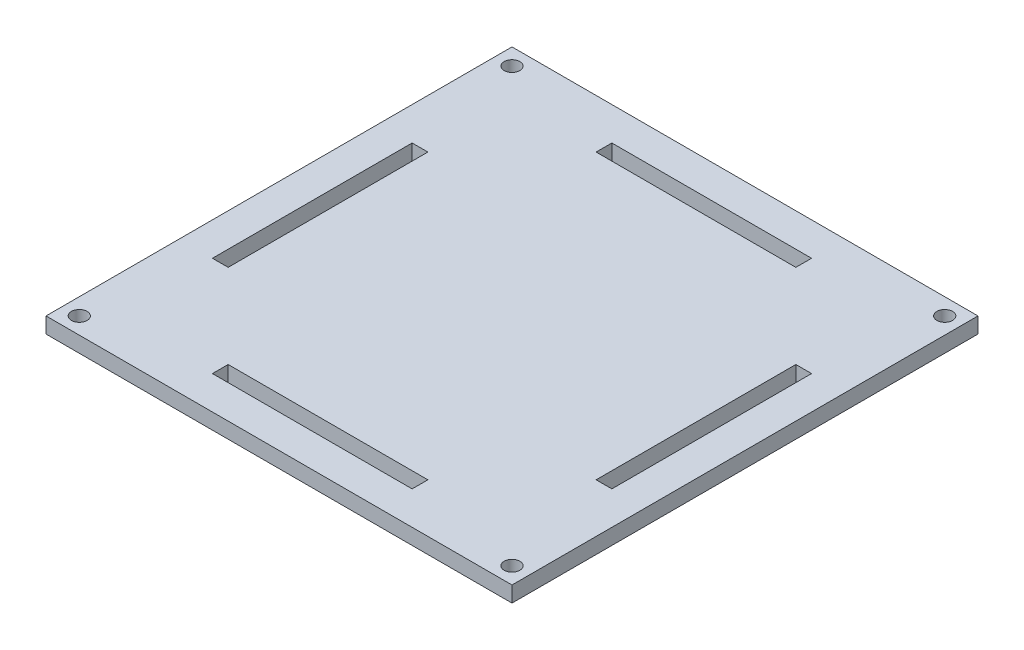
ISO-10303-21;
HEADER;
FILE_DESCRIPTION(('STEP AP214'),'2;1');
FILE_NAME('part.step','',(''),(''),'','','');
FILE_SCHEMA(('AUTOMOTIVE_DESIGN { 1 0 10303 214 1 1 1 1 }'));
ENDSEC;
DATA;
#1=APPLICATION_CONTEXT('core data for automotive mechanical design processes');
#2=APPLICATION_PROTOCOL_DEFINITION('international standard','automotive_design',2000,#1);
#3=PRODUCT_CONTEXT('',#1,'mechanical');
#4=PRODUCT('Part','Part','',(#3));
#5=PRODUCT_RELATED_PRODUCT_CATEGORY('part','',(#4));
#6=PRODUCT_DEFINITION_FORMATION('','',#4);
#7=PRODUCT_DEFINITION_CONTEXT('part definition',#1,'design');
#8=PRODUCT_DEFINITION('design','',#6,#7);
#9=PRODUCT_DEFINITION_SHAPE('','',#8);
#10=(LENGTH_UNIT() NAMED_UNIT(*) SI_UNIT(.MILLI.,.METRE.));
#11=(NAMED_UNIT(*) PLANE_ANGLE_UNIT() SI_UNIT($,.RADIAN.));
#12=(NAMED_UNIT(*) SI_UNIT($,.STERADIAN.) SOLID_ANGLE_UNIT());
#13=UNCERTAINTY_MEASURE_WITH_UNIT(LENGTH_MEASURE(1.E-05),#10,'distance_accuracy_value','');
#14=(GEOMETRIC_REPRESENTATION_CONTEXT(3) GLOBAL_UNCERTAINTY_ASSIGNED_CONTEXT((#13)) GLOBAL_UNIT_ASSIGNED_CONTEXT((#10,
#11,#12)) REPRESENTATION_CONTEXT('',''));
#15=CARTESIAN_POINT('',(0.,0.,0.));
#16=DIRECTION('',(0.,0.,1.));
#17=DIRECTION('',(1.,0.,0.));
#18=AXIS2_PLACEMENT_3D('',#15,#16,#17);
#19=CARTESIAN_POINT('',(44.45,0.,88.9));
#20=DIRECTION('',(1.,0.,0.));
#21=DIRECTION('',(0.,0.,-1.));
#22=AXIS2_PLACEMENT_3D('',#19,#20,#21);
#23=PLANE('',#22);
#24=DIRECTION('',(0.,-1.,0.));
#25=VECTOR('',#24,1.);
#26=CARTESIAN_POINT('',(44.45,0.,0.));
#27=LINE('',#26,#25);
#28=CARTESIAN_POINT('',(44.45,1.5,0.));
#29=VERTEX_POINT('',#28);
#30=CARTESIAN_POINT('',(44.45,-1.5,0.));
#31=VERTEX_POINT('',#30);
#32=EDGE_CURVE('E378',#29,#31,#27,.T.);
#33=ORIENTED_EDGE('',*,*,#32,.F.);
#34=DIRECTION('',(0.,0.,-1.));
#35=VECTOR('',#34,1.);
#36=CARTESIAN_POINT('',(44.45,1.5,88.9));
#37=LINE('',#36,#35);
#38=CARTESIAN_POINT('',(44.45,1.5,88.9));
#39=VERTEX_POINT('',#38);
#40=EDGE_CURVE('E12',#39,#29,#37,.T.);
#41=ORIENTED_EDGE('',*,*,#40,.F.);
#42=DIRECTION('',(0.,-1.,0.));
#43=VECTOR('',#42,1.);
#44=CARTESIAN_POINT('',(44.45,0.,88.9));
#45=LINE('',#44,#43);
#46=CARTESIAN_POINT('',(44.45,-1.5,88.9));
#47=VERTEX_POINT('',#46);
#48=EDGE_CURVE('E379',#39,#47,#45,.T.);
#49=ORIENTED_EDGE('',*,*,#48,.T.);
#50=DIRECTION('',(0.,0.,-1.));
#51=VECTOR('',#50,1.);
#52=CARTESIAN_POINT('',(44.45,-1.5,88.9));
#53=LINE('',#52,#51);
#54=EDGE_CURVE('E398',#47,#31,#53,.T.);
#55=ORIENTED_EDGE('',*,*,#54,.T.);
#56=EDGE_LOOP('',(#33,#41,#49,#55));
#57=FACE_BOUND('',#56,.T.);
#58=ADVANCED_FACE('F49',(#57),#23,.T.);
#59=CARTESIAN_POINT('',(0.,1.5,88.9));
#60=DIRECTION('',(0.,1.,0.));
#61=DIRECTION('',(0.,0.,1.));
#62=AXIS2_PLACEMENT_3D('',#59,#60,#61);
#63=PLANE('',#62);
#64=DIRECTION('',(0.,0.,-1.));
#65=VECTOR('',#64,1.);
#66=CARTESIAN_POINT('',(-35.1,1.5,63.5));
#67=LINE('',#66,#65);
#68=CARTESIAN_POINT('',(-35.1,1.5,63.5));
#69=VERTEX_POINT('',#68);
#70=CARTESIAN_POINT('',(-35.1,1.5,25.4));
#71=VERTEX_POINT('',#70);
#72=EDGE_CURVE('E65',#69,#71,#67,.T.);
#73=ORIENTED_EDGE('',*,*,#72,.F.);
#74=DIRECTION('',(1.,0.,0.));
#75=VECTOR('',#74,1.);
#76=CARTESIAN_POINT('',(-38.1,1.5,63.5));
#77=LINE('',#76,#75);
#78=CARTESIAN_POINT('',(-38.1,1.5,63.5));
#79=VERTEX_POINT('',#78);
#80=EDGE_CURVE('E212',#79,#69,#77,.T.);
#81=ORIENTED_EDGE('',*,*,#80,.F.);
#82=DIRECTION('',(0.,0.,1.));
#83=VECTOR('',#82,1.);
#84=CARTESIAN_POINT('',(-38.1,1.5,63.5));
#85=LINE('',#84,#83);
#86=CARTESIAN_POINT('',(-38.1,1.5,25.4));
#87=VERTEX_POINT('',#86);
#88=EDGE_CURVE('E193',#87,#79,#85,.T.);
#89=ORIENTED_EDGE('',*,*,#88,.F.);
#90=DIRECTION('',(-1.,0.,0.));
#91=VECTOR('',#90,1.);
#92=CARTESIAN_POINT('',(-38.1,1.5,25.4));
#93=LINE('',#92,#91);
#94=EDGE_CURVE('E204',#71,#87,#93,.T.);
#95=ORIENTED_EDGE('',*,*,#94,.F.);
#96=EDGE_LOOP('',(#73,#81,#89,#95));
#97=FACE_BOUND('',#96,.T.);
#98=DIRECTION('',(0.,0.,-1.));
#99=VECTOR('',#98,1.);
#100=CARTESIAN_POINT('',(19.0500000000001,1.5,6.35000000000006));
#101=LINE('',#100,#99);
#102=CARTESIAN_POINT('',(19.0500000000001,1.5,9.35000000000006));
#103=VERTEX_POINT('',#102);
#104=CARTESIAN_POINT('',(19.0500000000001,1.5,6.35000000000006));
#105=VERTEX_POINT('',#104);
#106=EDGE_CURVE('E73',#103,#105,#101,.T.);
#107=ORIENTED_EDGE('',*,*,#106,.F.);
#108=DIRECTION('',(1.,0.,0.));
#109=VECTOR('',#108,1.);
#110=CARTESIAN_POINT('',(-19.0499999999999,1.5,9.34999999999993));
#111=LINE('',#110,#109);
#112=CARTESIAN_POINT('',(-19.0499999999999,1.5,9.34999999999993));
#113=VERTEX_POINT('',#112);
#114=EDGE_CURVE('E540',#113,#103,#111,.T.);
#115=ORIENTED_EDGE('',*,*,#114,.F.);
#116=DIRECTION('',(0.,0.,1.));
#117=VECTOR('',#116,1.);
#118=CARTESIAN_POINT('',(-19.0499999999999,1.5,6.34999999999993));
#119=LINE('',#118,#117);
#120=CARTESIAN_POINT('',(-19.0499999999999,1.5,6.34999999999993));
#121=VERTEX_POINT('',#120);
#122=EDGE_CURVE('E551',#121,#113,#119,.T.);
#123=ORIENTED_EDGE('',*,*,#122,.F.);
#124=DIRECTION('',(-1.,0.,0.));
#125=VECTOR('',#124,1.);
#126=CARTESIAN_POINT('',(-19.0499999999999,1.5,6.34999999999993));
#127=LINE('',#126,#125);
#128=EDGE_CURVE('E235',#105,#121,#127,.T.);
#129=ORIENTED_EDGE('',*,*,#128,.F.);
#130=EDGE_LOOP('',(#107,#115,#123,#129));
#131=FACE_BOUND('',#130,.T.);
#132=DIRECTION('',(1.,0.,0.));
#133=VECTOR('',#132,1.);
#134=CARTESIAN_POINT('',(38.0999999999999,1.5,63.5000000000003));
#135=LINE('',#134,#133);
#136=CARTESIAN_POINT('',(35.0999999999999,1.5,63.5000000000002));
#137=VERTEX_POINT('',#136);
#138=CARTESIAN_POINT('',(38.0999999999999,1.5,63.5000000000003));
#139=VERTEX_POINT('',#138);
#140=EDGE_CURVE('E290',#137,#139,#135,.T.);
#141=ORIENTED_EDGE('',*,*,#140,.F.);
#142=DIRECTION('',(0.,0.,1.));
#143=VECTOR('',#142,1.);
#144=CARTESIAN_POINT('',(35.1000000000001,1.5,25.4000000000003));
#145=LINE('',#144,#143);
#146=CARTESIAN_POINT('',(35.1000000000001,1.5,25.4000000000003));
#147=VERTEX_POINT('',#146);
#148=EDGE_CURVE('E259',#147,#137,#145,.T.);
#149=ORIENTED_EDGE('',*,*,#148,.F.);
#150=DIRECTION('',(-1.,0.,0.));
#151=VECTOR('',#150,1.);
#152=CARTESIAN_POINT('',(38.1000000000001,1.5,25.4000000000003));
#153=LINE('',#152,#151);
#154=CARTESIAN_POINT('',(38.1000000000001,1.5,25.4000000000003));
#155=VERTEX_POINT('',#154);
#156=EDGE_CURVE('E274',#155,#147,#153,.T.);
#157=ORIENTED_EDGE('',*,*,#156,.F.);
#158=DIRECTION('',(0.,0.,-1.));
#159=VECTOR('',#158,1.);
#160=CARTESIAN_POINT('',(38.1000000000001,1.5,25.4000000000003));
#161=LINE('',#160,#159);
#162=EDGE_CURVE('E286',#139,#155,#161,.T.);
#163=ORIENTED_EDGE('',*,*,#162,.F.);
#164=EDGE_LOOP('',(#141,#149,#157,#163));
#165=FACE_BOUND('',#164,.T.);
#166=DIRECTION('',(0.,0.,1.));
#167=VECTOR('',#166,1.);
#168=CARTESIAN_POINT('',(-19.0500000000004,1.5,82.5499999999998));
#169=LINE('',#168,#167);
#170=CARTESIAN_POINT('',(-19.0500000000004,1.5,79.5499999999998));
#171=VERTEX_POINT('',#170);
#172=CARTESIAN_POINT('',(-19.0500000000004,1.5,82.5499999999998));
#173=VERTEX_POINT('',#172);
#174=EDGE_CURVE('E254',#171,#173,#169,.T.);
#175=ORIENTED_EDGE('',*,*,#174,.F.);
#176=DIRECTION('',(-1.,0.,0.));
#177=VECTOR('',#176,1.);
#178=CARTESIAN_POINT('',(19.0499999999996,1.5,79.5500000000002));
#179=LINE('',#178,#177);
#180=CARTESIAN_POINT('',(19.0499999999996,1.5,79.5500000000002));
#181=VERTEX_POINT('',#180);
#182=EDGE_CURVE('E310',#181,#171,#179,.T.);
#183=ORIENTED_EDGE('',*,*,#182,.F.);
#184=DIRECTION('',(0.,0.,-1.));
#185=VECTOR('',#184,1.);
#186=CARTESIAN_POINT('',(19.0499999999996,1.5,82.5500000000002));
#187=LINE('',#186,#185);
#188=CARTESIAN_POINT('',(19.0499999999996,1.5,82.5500000000002));
#189=VERTEX_POINT('',#188);
#190=EDGE_CURVE('E325',#189,#181,#187,.T.);
#191=ORIENTED_EDGE('',*,*,#190,.F.);
#192=DIRECTION('',(1.,0.,0.));
#193=VECTOR('',#192,1.);
#194=CARTESIAN_POINT('',(19.0499999999996,1.5,82.5500000000002));
#195=LINE('',#194,#193);
#196=EDGE_CURVE('E333',#173,#189,#195,.T.);
#197=ORIENTED_EDGE('',*,*,#196,.F.);
#198=EDGE_LOOP('',(#175,#183,#191,#197));
#199=FACE_BOUND('',#198,.T.);
#200=CARTESIAN_POINT('',(41.275,1.5,85.725));
#201=DIRECTION('',(0.,1.,0.));
#202=DIRECTION('',(0.,0.,1.));
#203=AXIS2_PLACEMENT_3D('',#200,#201,#202);
#204=CIRCLE('',#203,1.5);
#205=CARTESIAN_POINT('',(41.275,1.5,87.225));
#206=VERTEX_POINT('',#205);
#207=EDGE_CURVE('E372',#206,#206,#204,.T.);
#208=ORIENTED_EDGE('',*,*,#207,.F.);
#209=EDGE_LOOP('',(#208));
#210=FACE_BOUND('',#209,.T.);
#211=CARTESIAN_POINT('',(41.275,1.5,3.17500000000001));
#212=DIRECTION('',(0.,1.,0.));
#213=DIRECTION('',(0.,0.,1.));
#214=AXIS2_PLACEMENT_3D('',#211,#212,#213);
#215=CIRCLE('',#214,1.50000000000001);
#216=CARTESIAN_POINT('',(41.275,1.5,4.67500000000002));
#217=VERTEX_POINT('',#216);
#218=EDGE_CURVE('E353',#217,#217,#215,.T.);
#219=ORIENTED_EDGE('',*,*,#218,.F.);
#220=EDGE_LOOP('',(#219));
#221=FACE_BOUND('',#220,.T.);
#222=CARTESIAN_POINT('',(-41.275,1.5,3.17500000000001));
#223=DIRECTION('',(0.,1.,0.));
#224=DIRECTION('',(0.,0.,1.));
#225=AXIS2_PLACEMENT_3D('',#222,#223,#224);
#226=CIRCLE('',#225,1.50000000000001);
#227=CARTESIAN_POINT('',(-41.275,1.5,4.67500000000002));
#228=VERTEX_POINT('',#227);
#229=EDGE_CURVE('E352',#228,#228,#226,.T.);
#230=ORIENTED_EDGE('',*,*,#229,.F.);
#231=EDGE_LOOP('',(#230));
#232=FACE_BOUND('',#231,.T.);
#233=CARTESIAN_POINT('',(-41.275,1.5,85.725));
#234=DIRECTION('',(0.,1.,0.));
#235=DIRECTION('',(0.,0.,1.));
#236=AXIS2_PLACEMENT_3D('',#233,#234,#235);
#237=CIRCLE('',#236,1.50000000000001);
#238=CARTESIAN_POINT('',(-41.275,1.5,87.225));
#239=VERTEX_POINT('',#238);
#240=EDGE_CURVE('E358',#239,#239,#237,.T.);
#241=ORIENTED_EDGE('',*,*,#240,.F.);
#242=EDGE_LOOP('',(#241));
#243=FACE_BOUND('',#242,.T.);
#244=DIRECTION('',(1.,0.,0.));
#245=VECTOR('',#244,1.);
#246=CARTESIAN_POINT('',(0.,1.5,0.));
#247=LINE('',#246,#245);
#248=CARTESIAN_POINT('',(-44.45,1.5,0.));
#249=VERTEX_POINT('',#248);
#250=EDGE_CURVE('E407',#249,#29,#247,.T.);
#251=ORIENTED_EDGE('',*,*,#250,.F.);
#252=DIRECTION('',(0.,0.,-1.));
#253=VECTOR('',#252,1.);
#254=CARTESIAN_POINT('',(-44.45,1.5,88.9));
#255=LINE('',#254,#253);
#256=CARTESIAN_POINT('',(-44.45,1.5,88.9));
#257=VERTEX_POINT('',#256);
#258=EDGE_CURVE('E58',#257,#249,#255,.T.);
#259=ORIENTED_EDGE('',*,*,#258,.F.);
#260=DIRECTION('',(1.,0.,0.));
#261=VECTOR('',#260,1.);
#262=CARTESIAN_POINT('',(0.,1.5,88.9));
#263=LINE('',#262,#261);
#264=EDGE_CURVE('E383',#257,#39,#263,.T.);
#265=ORIENTED_EDGE('',*,*,#264,.T.);
#266=ORIENTED_EDGE('',*,*,#40,.T.);
#267=EDGE_LOOP('',(#251,#259,#265,#266));
#268=FACE_BOUND('',#267,.T.);
#269=ADVANCED_FACE('F209',(#97,#131,#165,#199,#210,#221,#232,#243,#268),#63,.T.);
#270=CARTESIAN_POINT('',(-44.45,0.,88.9));
#271=DIRECTION('',(1.,0.,0.));
#272=DIRECTION('',(0.,0.,-1.));
#273=AXIS2_PLACEMENT_3D('',#270,#271,#272);
#274=PLANE('',#273);
#275=DIRECTION('',(0.,-1.,0.));
#276=VECTOR('',#275,1.);
#277=CARTESIAN_POINT('',(-44.45,0.,0.));
#278=LINE('',#277,#276);
#279=CARTESIAN_POINT('',(-44.45,-1.5,0.));
#280=VERTEX_POINT('',#279);
#281=EDGE_CURVE('E405',#249,#280,#278,.T.);
#282=ORIENTED_EDGE('',*,*,#281,.T.);
#283=DIRECTION('',(0.,0.,-1.));
#284=VECTOR('',#283,1.);
#285=CARTESIAN_POINT('',(-44.45,-1.5,88.9));
#286=LINE('',#285,#284);
#287=CARTESIAN_POINT('',(-44.45,-1.5,88.9));
#288=VERTEX_POINT('',#287);
#289=EDGE_CURVE('E394',#288,#280,#286,.T.);
#290=ORIENTED_EDGE('',*,*,#289,.F.);
#291=DIRECTION('',(0.,-1.,0.));
#292=VECTOR('',#291,1.);
#293=CARTESIAN_POINT('',(-44.45,0.,88.9));
#294=LINE('',#293,#292);
#295=EDGE_CURVE('E389',#257,#288,#294,.T.);
#296=ORIENTED_EDGE('',*,*,#295,.F.);
#297=ORIENTED_EDGE('',*,*,#258,.T.);
#298=EDGE_LOOP('',(#282,#290,#296,#297));
#299=FACE_BOUND('',#298,.T.);
#300=ADVANCED_FACE('F425',(#299),#274,.F.);
#301=CARTESIAN_POINT('',(0.,-1.5,88.9));
#302=DIRECTION('',(0.,1.,0.));
#303=DIRECTION('',(0.,0.,1.));
#304=AXIS2_PLACEMENT_3D('',#301,#302,#303);
#305=PLANE('',#304);
#306=DIRECTION('',(-1.,0.,0.));
#307=VECTOR('',#306,1.);
#308=CARTESIAN_POINT('',(-38.1,-1.5,63.5));
#309=LINE('',#308,#307);
#310=CARTESIAN_POINT('',(-35.1,-1.5,63.5));
#311=VERTEX_POINT('',#310);
#312=CARTESIAN_POINT('',(-38.1,-1.5,63.5));
#313=VERTEX_POINT('',#312);
#314=EDGE_CURVE('E463',#311,#313,#309,.T.);
#315=ORIENTED_EDGE('',*,*,#314,.F.);
#316=DIRECTION('',(0.,0.,1.));
#317=VECTOR('',#316,1.);
#318=CARTESIAN_POINT('',(-35.1,-1.5,63.5));
#319=LINE('',#318,#317);
#320=CARTESIAN_POINT('',(-35.1,-1.5,25.4));
#321=VERTEX_POINT('',#320);
#322=EDGE_CURVE('E523',#321,#311,#319,.T.);
#323=ORIENTED_EDGE('',*,*,#322,.F.);
#324=DIRECTION('',(1.,0.,0.));
#325=VECTOR('',#324,1.);
#326=CARTESIAN_POINT('',(-38.1,-1.5,25.4));
#327=LINE('',#326,#325);
#328=CARTESIAN_POINT('',(-38.1,-1.5,25.4));
#329=VERTEX_POINT('',#328);
#330=EDGE_CURVE('E521',#329,#321,#327,.T.);
#331=ORIENTED_EDGE('',*,*,#330,.F.);
#332=DIRECTION('',(0.,0.,-1.));
#333=VECTOR('',#332,1.);
#334=CARTESIAN_POINT('',(-38.1,-1.5,63.5));
#335=LINE('',#334,#333);
#336=EDGE_CURVE('E196',#313,#329,#335,.T.);
#337=ORIENTED_EDGE('',*,*,#336,.F.);
#338=EDGE_LOOP('',(#315,#323,#331,#337));
#339=FACE_BOUND('',#338,.T.);
#340=DIRECTION('',(-1.,0.,0.));
#341=VECTOR('',#340,1.);
#342=CARTESIAN_POINT('',(-19.0499999999999,-1.5,9.34999999999993));
#343=LINE('',#342,#341);
#344=CARTESIAN_POINT('',(19.0500000000001,-1.5,9.35000000000006));
#345=VERTEX_POINT('',#344);
#346=CARTESIAN_POINT('',(-19.0499999999999,-1.5,9.34999999999993));
#347=VERTEX_POINT('',#346);
#348=EDGE_CURVE('E241',#345,#347,#343,.T.);
#349=ORIENTED_EDGE('',*,*,#348,.F.);
#350=DIRECTION('',(0.,0.,1.));
#351=VECTOR('',#350,1.);
#352=CARTESIAN_POINT('',(19.0500000000001,-1.5,6.35000000000006));
#353=LINE('',#352,#351);
#354=CARTESIAN_POINT('',(19.0500000000001,-1.5,6.35000000000006));
#355=VERTEX_POINT('',#354);
#356=EDGE_CURVE('E238',#355,#345,#353,.T.);
#357=ORIENTED_EDGE('',*,*,#356,.F.);
#358=DIRECTION('',(1.,0.,0.));
#359=VECTOR('',#358,1.);
#360=CARTESIAN_POINT('',(-19.0499999999999,-1.5,6.34999999999993));
#361=LINE('',#360,#359);
#362=CARTESIAN_POINT('',(-19.0499999999999,-1.5,6.34999999999993));
#363=VERTEX_POINT('',#362);
#364=EDGE_CURVE('E242',#363,#355,#361,.T.);
#365=ORIENTED_EDGE('',*,*,#364,.F.);
#366=DIRECTION('',(0.,0.,-1.));
#367=VECTOR('',#366,1.);
#368=CARTESIAN_POINT('',(-19.0499999999999,-1.5,6.34999999999993));
#369=LINE('',#368,#367);
#370=EDGE_CURVE('E245',#347,#363,#369,.T.);
#371=ORIENTED_EDGE('',*,*,#370,.F.);
#372=EDGE_LOOP('',(#349,#357,#365,#371));
#373=FACE_BOUND('',#372,.T.);
#374=DIRECTION('',(0.,0.,-1.));
#375=VECTOR('',#374,1.);
#376=CARTESIAN_POINT('',(35.1000000000001,-1.5,25.4000000000003));
#377=LINE('',#376,#375);
#378=CARTESIAN_POINT('',(35.0999999999999,-1.5,63.5000000000002));
#379=VERTEX_POINT('',#378);
#380=CARTESIAN_POINT('',(35.1000000000001,-1.5,25.4000000000003));
#381=VERTEX_POINT('',#380);
#382=EDGE_CURVE('E296',#379,#381,#377,.T.);
#383=ORIENTED_EDGE('',*,*,#382,.F.);
#384=DIRECTION('',(-1.,0.,0.));
#385=VECTOR('',#384,1.);
#386=CARTESIAN_POINT('',(38.0999999999999,-1.5,63.5000000000003));
#387=LINE('',#386,#385);
#388=CARTESIAN_POINT('',(38.0999999999999,-1.5,63.5000000000003));
#389=VERTEX_POINT('',#388);
#390=EDGE_CURVE('E253',#389,#379,#387,.T.);
#391=ORIENTED_EDGE('',*,*,#390,.F.);
#392=DIRECTION('',(0.,0.,1.));
#393=VECTOR('',#392,1.);
#394=CARTESIAN_POINT('',(38.1000000000001,-1.5,25.4000000000003));
#395=LINE('',#394,#393);
#396=CARTESIAN_POINT('',(38.1000000000001,-1.5,25.4000000000003));
#397=VERTEX_POINT('',#396);
#398=EDGE_CURVE('E250',#397,#389,#395,.T.);
#399=ORIENTED_EDGE('',*,*,#398,.F.);
#400=DIRECTION('',(1.,0.,0.));
#401=VECTOR('',#400,1.);
#402=CARTESIAN_POINT('',(38.1000000000001,-1.5,25.4000000000003));
#403=LINE('',#402,#401);
#404=EDGE_CURVE('E269',#381,#397,#403,.T.);
#405=ORIENTED_EDGE('',*,*,#404,.F.);
#406=EDGE_LOOP('',(#383,#391,#399,#405));
#407=FACE_BOUND('',#406,.T.);
#408=DIRECTION('',(1.,0.,0.));
#409=VECTOR('',#408,1.);
#410=CARTESIAN_POINT('',(19.0499999999996,-1.5,79.5500000000002));
#411=LINE('',#410,#409);
#412=CARTESIAN_POINT('',(-19.0500000000004,-1.5,79.5499999999998));
#413=VERTEX_POINT('',#412);
#414=CARTESIAN_POINT('',(19.0499999999996,-1.5,79.5500000000002));
#415=VERTEX_POINT('',#414);
#416=EDGE_CURVE('E342',#413,#415,#411,.T.);
#417=ORIENTED_EDGE('',*,*,#416,.F.);
#418=DIRECTION('',(0.,0.,-1.));
#419=VECTOR('',#418,1.);
#420=CARTESIAN_POINT('',(-19.0500000000004,-1.5,82.5499999999998));
#421=LINE('',#420,#419);
#422=CARTESIAN_POINT('',(-19.0500000000004,-1.5,82.5499999999998));
#423=VERTEX_POINT('',#422);
#424=EDGE_CURVE('E305',#423,#413,#421,.T.);
#425=ORIENTED_EDGE('',*,*,#424,.F.);
#426=DIRECTION('',(-1.,0.,0.));
#427=VECTOR('',#426,1.);
#428=CARTESIAN_POINT('',(19.0499999999996,-1.5,82.5500000000002));
#429=LINE('',#428,#427);
#430=CARTESIAN_POINT('',(19.0499999999996,-1.5,82.5500000000002));
#431=VERTEX_POINT('',#430);
#432=EDGE_CURVE('E302',#431,#423,#429,.T.);
#433=ORIENTED_EDGE('',*,*,#432,.F.);
#434=DIRECTION('',(0.,0.,1.));
#435=VECTOR('',#434,1.);
#436=CARTESIAN_POINT('',(19.0499999999996,-1.5,82.5500000000002));
#437=LINE('',#436,#435);
#438=EDGE_CURVE('E320',#415,#431,#437,.T.);
#439=ORIENTED_EDGE('',*,*,#438,.F.);
#440=EDGE_LOOP('',(#417,#425,#433,#439));
#441=FACE_BOUND('',#440,.T.);
#442=CARTESIAN_POINT('',(41.275,-1.5,85.725));
#443=DIRECTION('',(0.,1.,0.));
#444=DIRECTION('',(0.,0.,1.));
#445=AXIS2_PLACEMENT_3D('',#442,#443,#444);
#446=CIRCLE('',#445,1.5);
#447=CARTESIAN_POINT('',(41.275,-1.5,87.225));
#448=VERTEX_POINT('',#447);
#449=EDGE_CURVE('E479',#448,#448,#446,.F.);
#450=ORIENTED_EDGE('',*,*,#449,.F.);
#451=EDGE_LOOP('',(#450));
#452=FACE_BOUND('',#451,.T.);
#453=CARTESIAN_POINT('',(41.275,-1.5,3.17500000000001));
#454=DIRECTION('',(0.,1.,0.));
#455=DIRECTION('',(0.,0.,1.));
#456=AXIS2_PLACEMENT_3D('',#453,#454,#455);
#457=CIRCLE('',#456,1.50000000000001);
#458=CARTESIAN_POINT('',(41.275,-1.5,4.67500000000002));
#459=VERTEX_POINT('',#458);
#460=EDGE_CURVE('E359',#459,#459,#457,.F.);
#461=ORIENTED_EDGE('',*,*,#460,.F.);
#462=EDGE_LOOP('',(#461));
#463=FACE_BOUND('',#462,.T.);
#464=CARTESIAN_POINT('',(-41.275,-1.5,3.17500000000001));
#465=DIRECTION('',(0.,1.,0.));
#466=DIRECTION('',(0.,0.,1.));
#467=AXIS2_PLACEMENT_3D('',#464,#465,#466);
#468=CIRCLE('',#467,1.50000000000001);
#469=CARTESIAN_POINT('',(-41.275,-1.5,4.67500000000002));
#470=VERTEX_POINT('',#469);
#471=EDGE_CURVE('E348',#470,#470,#468,.F.);
#472=ORIENTED_EDGE('',*,*,#471,.F.);
#473=EDGE_LOOP('',(#472));
#474=FACE_BOUND('',#473,.T.);
#475=CARTESIAN_POINT('',(-41.275,-1.5,85.725));
#476=DIRECTION('',(0.,1.,0.));
#477=DIRECTION('',(0.,0.,1.));
#478=AXIS2_PLACEMENT_3D('',#475,#476,#477);
#479=CIRCLE('',#478,1.50000000000001);
#480=CARTESIAN_POINT('',(-41.275,-1.5,87.225));
#481=VERTEX_POINT('',#480);
#482=EDGE_CURVE('E371',#481,#481,#479,.F.);
#483=ORIENTED_EDGE('',*,*,#482,.F.);
#484=EDGE_LOOP('',(#483));
#485=FACE_BOUND('',#484,.T.);
#486=DIRECTION('',(1.,0.,0.));
#487=VECTOR('',#486,1.);
#488=CARTESIAN_POINT('',(0.,-1.5,0.));
#489=LINE('',#488,#487);
#490=EDGE_CURVE('E384',#280,#31,#489,.T.);
#491=ORIENTED_EDGE('',*,*,#490,.T.);
#492=ORIENTED_EDGE('',*,*,#54,.F.);
#493=DIRECTION('',(1.,0.,0.));
#494=VECTOR('',#493,1.);
#495=CARTESIAN_POINT('',(0.,-1.5,88.9));
#496=LINE('',#495,#494);
#497=EDGE_CURVE('E401',#288,#47,#496,.T.);
#498=ORIENTED_EDGE('',*,*,#497,.F.);
#499=ORIENTED_EDGE('',*,*,#289,.T.);
#500=EDGE_LOOP('',(#491,#492,#498,#499));
#501=FACE_BOUND('',#500,.T.);
#502=ADVANCED_FACE('F429',(#339,#373,#407,#441,#452,#463,#474,#485,#501),#305,.F.);
#503=CARTESIAN_POINT('',(0.,0.,88.9));
#504=DIRECTION('',(0.,0.,1.));
#505=DIRECTION('',(1.,0.,0.));
#506=AXIS2_PLACEMENT_3D('',#503,#504,#505);
#507=PLANE('',#506);
#508=ORIENTED_EDGE('',*,*,#48,.F.);
#509=ORIENTED_EDGE('',*,*,#264,.F.);
#510=ORIENTED_EDGE('',*,*,#295,.T.);
#511=ORIENTED_EDGE('',*,*,#497,.T.);
#512=EDGE_LOOP('',(#508,#509,#510,#511));
#513=FACE_BOUND('',#512,.T.);
#514=ADVANCED_FACE('F423',(#513),#507,.T.);
#515=CARTESIAN_POINT('',(0.,0.,0.));
#516=DIRECTION('',(0.,0.,1.));
#517=DIRECTION('',(1.,0.,0.));
#518=AXIS2_PLACEMENT_3D('',#515,#516,#517);
#519=PLANE('',#518);
#520=ORIENTED_EDGE('',*,*,#32,.T.);
#521=ORIENTED_EDGE('',*,*,#490,.F.);
#522=ORIENTED_EDGE('',*,*,#281,.F.);
#523=ORIENTED_EDGE('',*,*,#250,.T.);
#524=EDGE_LOOP('',(#520,#521,#522,#523));
#525=FACE_BOUND('',#524,.T.);
#526=ADVANCED_FACE('F435',(#525),#519,.F.);
#527=CARTESIAN_POINT('',(-41.275,-5.74264068711932,85.725));
#528=DIRECTION('',(0.,1.,0.));
#529=DIRECTION('',(0.,0.,1.));
#530=AXIS2_PLACEMENT_3D('',#527,#528,#529);
#531=CYLINDRICAL_SURFACE('',#530,1.50000000000001);
#532=ORIENTED_EDGE('',*,*,#482,.T.);
#533=EDGE_LOOP('',(#532));
#534=FACE_BOUND('',#533,.T.);
#535=ORIENTED_EDGE('',*,*,#240,.T.);
#536=EDGE_LOOP('',(#535));
#537=FACE_BOUND('',#536,.T.);
#538=ADVANCED_FACE('F437',(#534,#537),#531,.F.);
#539=CARTESIAN_POINT('',(-41.275,-5.74264068711932,3.17500000000001));
#540=DIRECTION('',(0.,1.,0.));
#541=DIRECTION('',(0.,0.,1.));
#542=AXIS2_PLACEMENT_3D('',#539,#540,#541);
#543=CYLINDRICAL_SURFACE('',#542,1.50000000000001);
#544=ORIENTED_EDGE('',*,*,#471,.T.);
#545=EDGE_LOOP('',(#544));
#546=FACE_BOUND('',#545,.T.);
#547=ORIENTED_EDGE('',*,*,#229,.T.);
#548=EDGE_LOOP('',(#547));
#549=FACE_BOUND('',#548,.T.);
#550=ADVANCED_FACE('F443',(#546,#549),#543,.F.);
#551=CARTESIAN_POINT('',(41.275,-5.74264068711932,3.17500000000001));
#552=DIRECTION('',(0.,1.,0.));
#553=DIRECTION('',(0.,0.,1.));
#554=AXIS2_PLACEMENT_3D('',#551,#552,#553);
#555=CYLINDRICAL_SURFACE('',#554,1.50000000000001);
#556=ORIENTED_EDGE('',*,*,#460,.T.);
#557=EDGE_LOOP('',(#556));
#558=FACE_BOUND('',#557,.T.);
#559=ORIENTED_EDGE('',*,*,#218,.T.);
#560=EDGE_LOOP('',(#559));
#561=FACE_BOUND('',#560,.T.);
#562=ADVANCED_FACE('F492',(#558,#561),#555,.F.);
#563=CARTESIAN_POINT('',(41.275,-5.74264068711932,85.725));
#564=DIRECTION('',(0.,1.,0.));
#565=DIRECTION('',(0.,0.,1.));
#566=AXIS2_PLACEMENT_3D('',#563,#564,#565);
#567=CYLINDRICAL_SURFACE('',#566,1.5);
#568=ORIENTED_EDGE('',*,*,#449,.T.);
#569=EDGE_LOOP('',(#568));
#570=FACE_BOUND('',#569,.T.);
#571=ORIENTED_EDGE('',*,*,#207,.T.);
#572=EDGE_LOOP('',(#571));
#573=FACE_BOUND('',#572,.T.);
#574=ADVANCED_FACE('F499',(#570,#573),#567,.F.);
#575=CARTESIAN_POINT('',(-19.0500000000004,-39.7179277303206,82.5499999999998));
#576=DIRECTION('',(-1.,0.,0.));
#577=DIRECTION('',(0.,0.,1.));
#578=AXIS2_PLACEMENT_3D('',#575,#576,#577);
#579=PLANE('',#578);
#580=ORIENTED_EDGE('',*,*,#424,.T.);
#581=DIRECTION('',(0.,1.,0.));
#582=VECTOR('',#581,1.);
#583=CARTESIAN_POINT('',(-19.0500000000004,-39.7179277303206,79.5499999999998));
#584=LINE('',#583,#582);
#585=EDGE_CURVE('E317',#413,#171,#584,.T.);
#586=ORIENTED_EDGE('',*,*,#585,.T.);
#587=ORIENTED_EDGE('',*,*,#174,.T.);
#588=DIRECTION('',(0.,1.,0.));
#589=VECTOR('',#588,1.);
#590=CARTESIAN_POINT('',(-19.0500000000004,-39.7179277303206,82.5499999999998));
#591=LINE('',#590,#589);
#592=EDGE_CURVE('E306',#423,#173,#591,.T.);
#593=ORIENTED_EDGE('',*,*,#592,.F.);
#594=EDGE_LOOP('',(#580,#586,#587,#593));
#595=FACE_BOUND('',#594,.T.);
#596=ADVANCED_FACE('F507',(#595),#579,.F.);
#597=CARTESIAN_POINT('',(19.0499999999996,-39.7179277303206,79.5500000000002));
#598=DIRECTION('',(0.,0.,-1.));
#599=DIRECTION('',(-1.,0.,0.));
#600=AXIS2_PLACEMENT_3D('',#597,#598,#599);
#601=PLANE('',#600);
#602=ORIENTED_EDGE('',*,*,#416,.T.);
#603=DIRECTION('',(0.,1.,0.));
#604=VECTOR('',#603,1.);
#605=CARTESIAN_POINT('',(19.0499999999996,-39.7179277303206,79.5500000000002));
#606=LINE('',#605,#604);
#607=EDGE_CURVE('E314',#415,#181,#606,.T.);
#608=ORIENTED_EDGE('',*,*,#607,.T.);
#609=ORIENTED_EDGE('',*,*,#182,.T.);
#610=ORIENTED_EDGE('',*,*,#585,.F.);
#611=EDGE_LOOP('',(#602,#608,#609,#610));
#612=FACE_BOUND('',#611,.T.);
#613=ADVANCED_FACE('F503',(#612),#601,.F.);
#614=CARTESIAN_POINT('',(19.0499999999996,-39.7179277303206,82.5500000000002));
#615=DIRECTION('',(1.,0.,0.));
#616=DIRECTION('',(0.,0.,-1.));
#617=AXIS2_PLACEMENT_3D('',#614,#615,#616);
#618=PLANE('',#617);
#619=ORIENTED_EDGE('',*,*,#438,.T.);
#620=DIRECTION('',(0.,1.,0.));
#621=VECTOR('',#620,1.);
#622=CARTESIAN_POINT('',(19.0499999999996,-39.7179277303206,82.5500000000002));
#623=LINE('',#622,#621);
#624=EDGE_CURVE('E311',#431,#189,#623,.T.);
#625=ORIENTED_EDGE('',*,*,#624,.T.);
#626=ORIENTED_EDGE('',*,*,#190,.T.);
#627=ORIENTED_EDGE('',*,*,#607,.F.);
#628=EDGE_LOOP('',(#619,#625,#626,#627));
#629=FACE_BOUND('',#628,.T.);
#630=ADVANCED_FACE('F603',(#629),#618,.F.);
#631=CARTESIAN_POINT('',(19.0499999999996,-39.7179277303206,82.5500000000002));
#632=DIRECTION('',(0.,0.,1.));
#633=DIRECTION('',(1.,0.,0.));
#634=AXIS2_PLACEMENT_3D('',#631,#632,#633);
#635=PLANE('',#634);
#636=ORIENTED_EDGE('',*,*,#432,.T.);
#637=ORIENTED_EDGE('',*,*,#592,.T.);
#638=ORIENTED_EDGE('',*,*,#196,.T.);
#639=ORIENTED_EDGE('',*,*,#624,.F.);
#640=EDGE_LOOP('',(#636,#637,#638,#639));
#641=FACE_BOUND('',#640,.T.);
#642=ADVANCED_FACE('F593',(#641),#635,.F.);
#643=CARTESIAN_POINT('',(38.0999999999999,-39.7179277303206,63.5000000000003));
#644=DIRECTION('',(0.,0.,1.));
#645=DIRECTION('',(1.,0.,0.));
#646=AXIS2_PLACEMENT_3D('',#643,#644,#645);
#647=PLANE('',#646);
#648=ORIENTED_EDGE('',*,*,#390,.T.);
#649=DIRECTION('',(0.,1.,0.));
#650=VECTOR('',#649,1.);
#651=CARTESIAN_POINT('',(35.0999999999999,-39.7179277303206,63.5000000000002));
#652=LINE('',#651,#650);
#653=EDGE_CURVE('E266',#379,#137,#652,.T.);
#654=ORIENTED_EDGE('',*,*,#653,.T.);
#655=ORIENTED_EDGE('',*,*,#140,.T.);
#656=DIRECTION('',(0.,1.,0.));
#657=VECTOR('',#656,1.);
#658=CARTESIAN_POINT('',(38.0999999999999,-39.7179277303206,63.5000000000003));
#659=LINE('',#658,#657);
#660=EDGE_CURVE('E255',#389,#139,#659,.T.);
#661=ORIENTED_EDGE('',*,*,#660,.F.);
#662=EDGE_LOOP('',(#648,#654,#655,#661));
#663=FACE_BOUND('',#662,.T.);
#664=ADVANCED_FACE('F590',(#663),#647,.F.);
#665=CARTESIAN_POINT('',(35.1000000000001,-39.7179277303206,25.4000000000003));
#666=DIRECTION('',(-1.,0.,0.));
#667=DIRECTION('',(0.,0.,1.));
#668=AXIS2_PLACEMENT_3D('',#665,#666,#667);
#669=PLANE('',#668);
#670=ORIENTED_EDGE('',*,*,#382,.T.);
#671=DIRECTION('',(0.,1.,0.));
#672=VECTOR('',#671,1.);
#673=CARTESIAN_POINT('',(35.1000000000001,-39.7179277303206,25.4000000000003));
#674=LINE('',#673,#672);
#675=EDGE_CURVE('E263',#381,#147,#674,.T.);
#676=ORIENTED_EDGE('',*,*,#675,.T.);
#677=ORIENTED_EDGE('',*,*,#148,.T.);
#678=ORIENTED_EDGE('',*,*,#653,.F.);
#679=EDGE_LOOP('',(#670,#676,#677,#678));
#680=FACE_BOUND('',#679,.T.);
#681=ADVANCED_FACE('F592',(#680),#669,.F.);
#682=CARTESIAN_POINT('',(38.1000000000001,-39.7179277303206,25.4000000000003));
#683=DIRECTION('',(0.,0.,-1.));
#684=DIRECTION('',(-1.,0.,0.));
#685=AXIS2_PLACEMENT_3D('',#682,#683,#684);
#686=PLANE('',#685);
#687=ORIENTED_EDGE('',*,*,#404,.T.);
#688=DIRECTION('',(0.,1.,0.));
#689=VECTOR('',#688,1.);
#690=CARTESIAN_POINT('',(38.1000000000001,-39.7179277303206,25.4000000000003));
#691=LINE('',#690,#689);
#692=EDGE_CURVE('E260',#397,#155,#691,.T.);
#693=ORIENTED_EDGE('',*,*,#692,.T.);
#694=ORIENTED_EDGE('',*,*,#156,.T.);
#695=ORIENTED_EDGE('',*,*,#675,.F.);
#696=EDGE_LOOP('',(#687,#693,#694,#695));
#697=FACE_BOUND('',#696,.T.);
#698=ADVANCED_FACE('F579',(#697),#686,.F.);
#699=CARTESIAN_POINT('',(38.1000000000001,-39.7179277303206,25.4000000000003));
#700=DIRECTION('',(1.,0.,0.));
#701=DIRECTION('',(0.,0.,-1.));
#702=AXIS2_PLACEMENT_3D('',#699,#700,#701);
#703=PLANE('',#702);
#704=ORIENTED_EDGE('',*,*,#398,.T.);
#705=ORIENTED_EDGE('',*,*,#660,.T.);
#706=ORIENTED_EDGE('',*,*,#162,.T.);
#707=ORIENTED_EDGE('',*,*,#692,.F.);
#708=EDGE_LOOP('',(#704,#705,#706,#707));
#709=FACE_BOUND('',#708,.T.);
#710=ADVANCED_FACE('F572',(#709),#703,.F.);
#711=CARTESIAN_POINT('',(19.0500000000001,-39.7179277303206,6.35000000000006));
#712=DIRECTION('',(1.,0.,0.));
#713=DIRECTION('',(0.,0.,-1.));
#714=AXIS2_PLACEMENT_3D('',#711,#712,#713);
#715=PLANE('',#714);
#716=ORIENTED_EDGE('',*,*,#356,.T.);
#717=DIRECTION('',(0.,1.,0.));
#718=VECTOR('',#717,1.);
#719=CARTESIAN_POINT('',(19.0500000000001,-39.7179277303206,9.35000000000006));
#720=LINE('',#719,#718);
#721=EDGE_CURVE('E249',#345,#103,#720,.T.);
#722=ORIENTED_EDGE('',*,*,#721,.T.);
#723=ORIENTED_EDGE('',*,*,#106,.T.);
#724=DIRECTION('',(0.,1.,0.));
#725=VECTOR('',#724,1.);
#726=CARTESIAN_POINT('',(19.0500000000001,-39.7179277303206,6.35000000000006));
#727=LINE('',#726,#725);
#728=EDGE_CURVE('E537',#355,#105,#727,.T.);
#729=ORIENTED_EDGE('',*,*,#728,.F.);
#730=EDGE_LOOP('',(#716,#722,#723,#729));
#731=FACE_BOUND('',#730,.T.);
#732=ADVANCED_FACE('F570',(#731),#715,.F.);
#733=CARTESIAN_POINT('',(-19.0499999999999,-39.7179277303206,9.34999999999993));
#734=DIRECTION('',(0.,0.,1.));
#735=DIRECTION('',(1.,0.,0.));
#736=AXIS2_PLACEMENT_3D('',#733,#734,#735);
#737=PLANE('',#736);
#738=ORIENTED_EDGE('',*,*,#348,.T.);
#739=DIRECTION('',(0.,1.,0.));
#740=VECTOR('',#739,1.);
#741=CARTESIAN_POINT('',(-19.0499999999999,-39.7179277303206,9.34999999999993));
#742=LINE('',#741,#740);
#743=EDGE_CURVE('E544',#347,#113,#742,.T.);
#744=ORIENTED_EDGE('',*,*,#743,.T.);
#745=ORIENTED_EDGE('',*,*,#114,.T.);
#746=ORIENTED_EDGE('',*,*,#721,.F.);
#747=EDGE_LOOP('',(#738,#744,#745,#746));
#748=FACE_BOUND('',#747,.T.);
#749=ADVANCED_FACE('F567',(#748),#737,.F.);
#750=CARTESIAN_POINT('',(-19.0499999999999,-39.7179277303206,6.34999999999993));
#751=DIRECTION('',(-1.,0.,0.));
#752=DIRECTION('',(0.,0.,1.));
#753=AXIS2_PLACEMENT_3D('',#750,#751,#752);
#754=PLANE('',#753);
#755=ORIENTED_EDGE('',*,*,#370,.T.);
#756=DIRECTION('',(0.,1.,0.));
#757=VECTOR('',#756,1.);
#758=CARTESIAN_POINT('',(-19.0499999999999,-39.7179277303206,6.34999999999993));
#759=LINE('',#758,#757);
#760=EDGE_CURVE('E541',#363,#121,#759,.T.);
#761=ORIENTED_EDGE('',*,*,#760,.T.);
#762=ORIENTED_EDGE('',*,*,#122,.T.);
#763=ORIENTED_EDGE('',*,*,#743,.F.);
#764=EDGE_LOOP('',(#755,#761,#762,#763));
#765=FACE_BOUND('',#764,.T.);
#766=ADVANCED_FACE('F568',(#765),#754,.F.);
#767=CARTESIAN_POINT('',(-19.0499999999999,-39.7179277303206,6.34999999999993));
#768=DIRECTION('',(0.,0.,-1.));
#769=DIRECTION('',(-1.,0.,0.));
#770=AXIS2_PLACEMENT_3D('',#767,#768,#769);
#771=PLANE('',#770);
#772=ORIENTED_EDGE('',*,*,#364,.T.);
#773=ORIENTED_EDGE('',*,*,#728,.T.);
#774=ORIENTED_EDGE('',*,*,#128,.T.);
#775=ORIENTED_EDGE('',*,*,#760,.F.);
#776=EDGE_LOOP('',(#772,#773,#774,#775));
#777=FACE_BOUND('',#776,.T.);
#778=ADVANCED_FACE('F563',(#777),#771,.F.);
#779=CARTESIAN_POINT('',(-35.1,-39.7179277303206,63.5));
#780=DIRECTION('',(1.,0.,0.));
#781=DIRECTION('',(0.,0.,-1.));
#782=AXIS2_PLACEMENT_3D('',#779,#780,#781);
#783=PLANE('',#782);
#784=ORIENTED_EDGE('',*,*,#322,.T.);
#785=DIRECTION('',(0.,1.,0.));
#786=VECTOR('',#785,1.);
#787=CARTESIAN_POINT('',(-35.1,-39.7179277303206,63.5));
#788=LINE('',#787,#786);
#789=EDGE_CURVE('E885',#311,#69,#788,.T.);
#790=ORIENTED_EDGE('',*,*,#789,.T.);
#791=ORIENTED_EDGE('',*,*,#72,.T.);
#792=DIRECTION('',(0.,1.,0.));
#793=VECTOR('',#792,1.);
#794=CARTESIAN_POINT('',(-35.1,-39.7179277303206,25.4));
#795=LINE('',#794,#793);
#796=EDGE_CURVE('E201',#321,#71,#795,.T.);
#797=ORIENTED_EDGE('',*,*,#796,.F.);
#798=EDGE_LOOP('',(#784,#790,#791,#797));
#799=FACE_BOUND('',#798,.T.);
#800=ADVANCED_FACE('F584',(#799),#783,.F.);
#801=CARTESIAN_POINT('',(-38.1,-39.7179277303206,63.5));
#802=DIRECTION('',(0.,0.,1.));
#803=DIRECTION('',(1.,0.,0.));
#804=AXIS2_PLACEMENT_3D('',#801,#802,#803);
#805=PLANE('',#804);
#806=ORIENTED_EDGE('',*,*,#314,.T.);
#807=DIRECTION('',(0.,1.,0.));
#808=VECTOR('',#807,1.);
#809=CARTESIAN_POINT('',(-38.1,-39.7179277303206,63.5));
#810=LINE('',#809,#808);
#811=EDGE_CURVE('E200',#313,#79,#810,.T.);
#812=ORIENTED_EDGE('',*,*,#811,.T.);
#813=ORIENTED_EDGE('',*,*,#80,.T.);
#814=ORIENTED_EDGE('',*,*,#789,.F.);
#815=EDGE_LOOP('',(#806,#812,#813,#814));
#816=FACE_BOUND('',#815,.T.);
#817=ADVANCED_FACE('F825',(#816),#805,.F.);
#818=CARTESIAN_POINT('',(-38.1,-39.7179277303206,63.5));
#819=DIRECTION('',(-1.,0.,0.));
#820=DIRECTION('',(0.,0.,1.));
#821=AXIS2_PLACEMENT_3D('',#818,#819,#820);
#822=PLANE('',#821);
#823=ORIENTED_EDGE('',*,*,#336,.T.);
#824=DIRECTION('',(0.,1.,0.));
#825=VECTOR('',#824,1.);
#826=CARTESIAN_POINT('',(-38.1,-39.7179277303206,25.4));
#827=LINE('',#826,#825);
#828=EDGE_CURVE('E188',#329,#87,#827,.T.);
#829=ORIENTED_EDGE('',*,*,#828,.T.);
#830=ORIENTED_EDGE('',*,*,#88,.T.);
#831=ORIENTED_EDGE('',*,*,#811,.F.);
#832=EDGE_LOOP('',(#823,#829,#830,#831));
#833=FACE_BOUND('',#832,.T.);
#834=ADVANCED_FACE('F190',(#833),#822,.F.);
#835=CARTESIAN_POINT('',(-38.1,-39.7179277303206,25.4));
#836=DIRECTION('',(0.,0.,-1.));
#837=DIRECTION('',(-1.,0.,0.));
#838=AXIS2_PLACEMENT_3D('',#835,#836,#837);
#839=PLANE('',#838);
#840=ORIENTED_EDGE('',*,*,#330,.T.);
#841=ORIENTED_EDGE('',*,*,#796,.T.);
#842=ORIENTED_EDGE('',*,*,#94,.T.);
#843=ORIENTED_EDGE('',*,*,#828,.F.);
#844=EDGE_LOOP('',(#840,#841,#842,#843));
#845=FACE_BOUND('',#844,.T.);
#846=ADVANCED_FACE('F205',(#845),#839,.F.);
#847=CLOSED_SHELL('',(#58,#269,#300,#502,#514,#526,#538,#550,#562,#574,#596,#613,#630,#642,#664,
#681,#698,#710,#732,#749,#766,#778,#800,#817,#834,#846));
#848=MANIFOLD_SOLID_BREP('B2',#847);
#849=ADVANCED_BREP_SHAPE_REPRESENTATION('',(#18,#848),#14);
#850=SHAPE_DEFINITION_REPRESENTATION(#9,#849);
ENDSEC;
END-ISO-10303-21;
